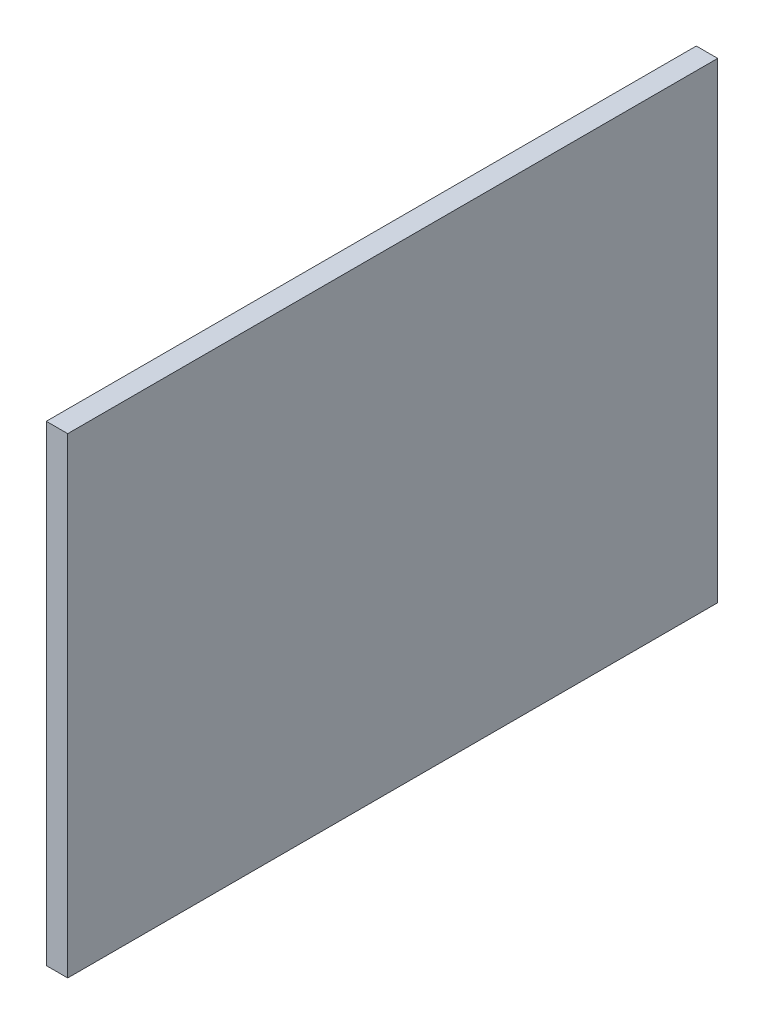
ISO-10303-21;
HEADER;
FILE_DESCRIPTION(('STEP AP214'),'2;1');
FILE_NAME('part.step','',(''),(''),'','','');
FILE_SCHEMA(('AUTOMOTIVE_DESIGN { 1 0 10303 214 1 1 1 1 }'));
ENDSEC;
DATA;
#1=APPLICATION_CONTEXT('core data for automotive mechanical design processes');
#2=APPLICATION_PROTOCOL_DEFINITION('international standard','automotive_design',2000,#1);
#3=PRODUCT_CONTEXT('',#1,'mechanical');
#4=PRODUCT('Part','Part','',(#3));
#5=PRODUCT_RELATED_PRODUCT_CATEGORY('part','',(#4));
#6=PRODUCT_DEFINITION_FORMATION('','',#4);
#7=PRODUCT_DEFINITION_CONTEXT('part definition',#1,'design');
#8=PRODUCT_DEFINITION('design','',#6,#7);
#9=PRODUCT_DEFINITION_SHAPE('','',#8);
#10=(LENGTH_UNIT() NAMED_UNIT(*) SI_UNIT(.MILLI.,.METRE.));
#11=(NAMED_UNIT(*) PLANE_ANGLE_UNIT() SI_UNIT($,.RADIAN.));
#12=(NAMED_UNIT(*) SI_UNIT($,.STERADIAN.) SOLID_ANGLE_UNIT());
#13=UNCERTAINTY_MEASURE_WITH_UNIT(LENGTH_MEASURE(1.E-05),#10,'distance_accuracy_value','');
#14=(GEOMETRIC_REPRESENTATION_CONTEXT(3) GLOBAL_UNCERTAINTY_ASSIGNED_CONTEXT((#13)) GLOBAL_UNIT_ASSIGNED_CONTEXT((#10,
#11,#12)) REPRESENTATION_CONTEXT('',''));
#15=CARTESIAN_POINT('',(0.,0.,0.));
#16=DIRECTION('',(0.,0.,1.));
#17=DIRECTION('',(1.,0.,0.));
#18=AXIS2_PLACEMENT_3D('',#15,#16,#17);
#19=CARTESIAN_POINT('',(19.05,0.,0.));
#20=DIRECTION('',(0.,0.,-1.));
#21=DIRECTION('',(0.,1.,0.));
#22=AXIS2_PLACEMENT_3D('',#19,#20,#21);
#23=PLANE('',#22);
#24=DIRECTION('',(0.,-1.,0.));
#25=VECTOR('',#24,1.);
#26=CARTESIAN_POINT('',(0.,0.,0.));
#27=LINE('',#26,#25);
#28=CARTESIAN_POINT('',(0.,419.1,-1.11022302462516E-13));
#29=VERTEX_POINT('',#28);
#30=CARTESIAN_POINT('',(0.,0.,0.));
#31=VERTEX_POINT('',#30);
#32=EDGE_CURVE('E96',#29,#31,#27,.T.);
#33=ORIENTED_EDGE('',*,*,#32,.T.);
#34=DIRECTION('',(-1.,0.,0.));
#35=VECTOR('',#34,1.);
#36=CARTESIAN_POINT('',(19.05,0.,0.));
#37=LINE('',#36,#35);
#38=CARTESIAN_POINT('',(19.05,0.,0.));
#39=VERTEX_POINT('',#38);
#40=EDGE_CURVE('E11',#39,#31,#37,.T.);
#41=ORIENTED_EDGE('',*,*,#40,.F.);
#42=DIRECTION('',(0.,-1.,0.));
#43=VECTOR('',#42,1.);
#44=CARTESIAN_POINT('',(19.05,0.,0.));
#45=LINE('',#44,#43);
#46=CARTESIAN_POINT('',(19.05,419.1,-1.11022302462516E-13));
#47=VERTEX_POINT('',#46);
#48=EDGE_CURVE('E84',#47,#39,#45,.T.);
#49=ORIENTED_EDGE('',*,*,#48,.F.);
#50=DIRECTION('',(-1.,0.,0.));
#51=VECTOR('',#50,1.);
#52=CARTESIAN_POINT('',(19.05,419.1,-1.11022302462516E-13));
#53=LINE('',#52,#51);
#54=EDGE_CURVE('E92',#47,#29,#53,.T.);
#55=ORIENTED_EDGE('',*,*,#54,.T.);
#56=EDGE_LOOP('',(#33,#41,#49,#55));
#57=FACE_BOUND('',#56,.T.);
#58=ADVANCED_FACE('F33',(#57),#23,.F.);
#59=CARTESIAN_POINT('',(19.05,0.,0.));
#60=DIRECTION('',(0.,1.,0.));
#61=DIRECTION('',(0.,0.,1.));
#62=AXIS2_PLACEMENT_3D('',#59,#60,#61);
#63=PLANE('',#62);
#64=DIRECTION('',(0.,0.,-1.));
#65=VECTOR('',#64,1.);
#66=CARTESIAN_POINT('',(0.,0.,0.));
#67=LINE('',#66,#65);
#68=CARTESIAN_POINT('',(0.,0.,-577.85));
#69=VERTEX_POINT('',#68);
#70=EDGE_CURVE('E88',#31,#69,#67,.T.);
#71=ORIENTED_EDGE('',*,*,#70,.T.);
#72=DIRECTION('',(-1.,0.,0.));
#73=VECTOR('',#72,1.);
#74=CARTESIAN_POINT('',(19.05,0.,-577.85));
#75=LINE('',#74,#73);
#76=CARTESIAN_POINT('',(19.05,0.,-577.85));
#77=VERTEX_POINT('',#76);
#78=EDGE_CURVE('E41',#77,#69,#75,.T.);
#79=ORIENTED_EDGE('',*,*,#78,.F.);
#80=DIRECTION('',(0.,0.,-1.));
#81=VECTOR('',#80,1.);
#82=CARTESIAN_POINT('',(19.05,0.,0.));
#83=LINE('',#82,#81);
#84=EDGE_CURVE('E79',#39,#77,#83,.T.);
#85=ORIENTED_EDGE('',*,*,#84,.F.);
#86=ORIENTED_EDGE('',*,*,#40,.T.);
#87=EDGE_LOOP('',(#71,#79,#85,#86));
#88=FACE_BOUND('',#87,.T.);
#89=ADVANCED_FACE('F87',(#88),#63,.F.);
#90=CARTESIAN_POINT('',(19.05,0.,-577.85));
#91=DIRECTION('',(0.,0.,1.));
#92=DIRECTION('',(1.,0.,0.));
#93=AXIS2_PLACEMENT_3D('',#90,#91,#92);
#94=PLANE('',#93);
#95=DIRECTION('',(0.,1.,0.));
#96=VECTOR('',#95,1.);
#97=CARTESIAN_POINT('',(0.,0.,-577.85));
#98=LINE('',#97,#96);
#99=CARTESIAN_POINT('',(0.,419.1,-577.85));
#100=VERTEX_POINT('',#99);
#101=EDGE_CURVE('E66',#69,#100,#98,.T.);
#102=ORIENTED_EDGE('',*,*,#101,.T.);
#103=DIRECTION('',(-1.,0.,0.));
#104=VECTOR('',#103,1.);
#105=CARTESIAN_POINT('',(19.05,419.1,-577.85));
#106=LINE('',#105,#104);
#107=CARTESIAN_POINT('',(19.05,419.1,-577.85));
#108=VERTEX_POINT('',#107);
#109=EDGE_CURVE('E89',#108,#100,#106,.T.);
#110=ORIENTED_EDGE('',*,*,#109,.F.);
#111=DIRECTION('',(0.,1.,0.));
#112=VECTOR('',#111,1.);
#113=CARTESIAN_POINT('',(19.05,0.,-577.85));
#114=LINE('',#113,#112);
#115=EDGE_CURVE('E82',#77,#108,#114,.T.);
#116=ORIENTED_EDGE('',*,*,#115,.F.);
#117=ORIENTED_EDGE('',*,*,#78,.T.);
#118=EDGE_LOOP('',(#102,#110,#116,#117));
#119=FACE_BOUND('',#118,.T.);
#120=ADVANCED_FACE('F90',(#119),#94,.F.);
#121=CARTESIAN_POINT('',(19.05,419.1,-1.11022302462516E-13));
#122=DIRECTION('',(0.,-1.,0.));
#123=DIRECTION('',(0.,0.,-1.));
#124=AXIS2_PLACEMENT_3D('',#121,#122,#123);
#125=PLANE('',#124);
#126=DIRECTION('',(0.,0.,1.));
#127=VECTOR('',#126,1.);
#128=CARTESIAN_POINT('',(0.,419.1,-1.11022302462516E-13));
#129=LINE('',#128,#127);
#130=EDGE_CURVE('E72',#100,#29,#129,.T.);
#131=ORIENTED_EDGE('',*,*,#130,.T.);
#132=ORIENTED_EDGE('',*,*,#54,.F.);
#133=DIRECTION('',(0.,0.,1.));
#134=VECTOR('',#133,1.);
#135=CARTESIAN_POINT('',(19.05,419.1,-1.11022302462516E-13));
#136=LINE('',#135,#134);
#137=EDGE_CURVE('E49',#108,#47,#136,.T.);
#138=ORIENTED_EDGE('',*,*,#137,.F.);
#139=ORIENTED_EDGE('',*,*,#109,.T.);
#140=EDGE_LOOP('',(#131,#132,#138,#139));
#141=FACE_BOUND('',#140,.T.);
#142=ADVANCED_FACE('F103',(#141),#125,.F.);
#143=CARTESIAN_POINT('',(19.05,0.,0.));
#144=DIRECTION('',(-1.,0.,0.));
#145=DIRECTION('',(0.,0.,1.));
#146=AXIS2_PLACEMENT_3D('',#143,#144,#145);
#147=PLANE('',#146);
#148=ORIENTED_EDGE('',*,*,#48,.T.);
#149=ORIENTED_EDGE('',*,*,#84,.T.);
#150=ORIENTED_EDGE('',*,*,#115,.T.);
#151=ORIENTED_EDGE('',*,*,#137,.T.);
#152=EDGE_LOOP('',(#148,#149,#150,#151));
#153=FACE_BOUND('',#152,.T.);
#154=ADVANCED_FACE('F80',(#153),#147,.F.);
#155=CARTESIAN_POINT('',(0.,0.,0.));
#156=DIRECTION('',(-1.,0.,0.));
#157=DIRECTION('',(0.,0.,1.));
#158=AXIS2_PLACEMENT_3D('',#155,#156,#157);
#159=PLANE('',#158);
#160=ORIENTED_EDGE('',*,*,#32,.F.);
#161=ORIENTED_EDGE('',*,*,#130,.F.);
#162=ORIENTED_EDGE('',*,*,#101,.F.);
#163=ORIENTED_EDGE('',*,*,#70,.F.);
#164=EDGE_LOOP('',(#160,#161,#162,#163));
#165=FACE_BOUND('',#164,.T.);
#166=ADVANCED_FACE('F106',(#165),#159,.T.);
#167=CLOSED_SHELL('',(#58,#89,#120,#142,#154,#166));
#168=MANIFOLD_SOLID_BREP('B2',#167);
#169=ADVANCED_BREP_SHAPE_REPRESENTATION('',(#18,#168),#14);
#170=SHAPE_DEFINITION_REPRESENTATION(#9,#169);
ENDSEC;
END-ISO-10303-21;
